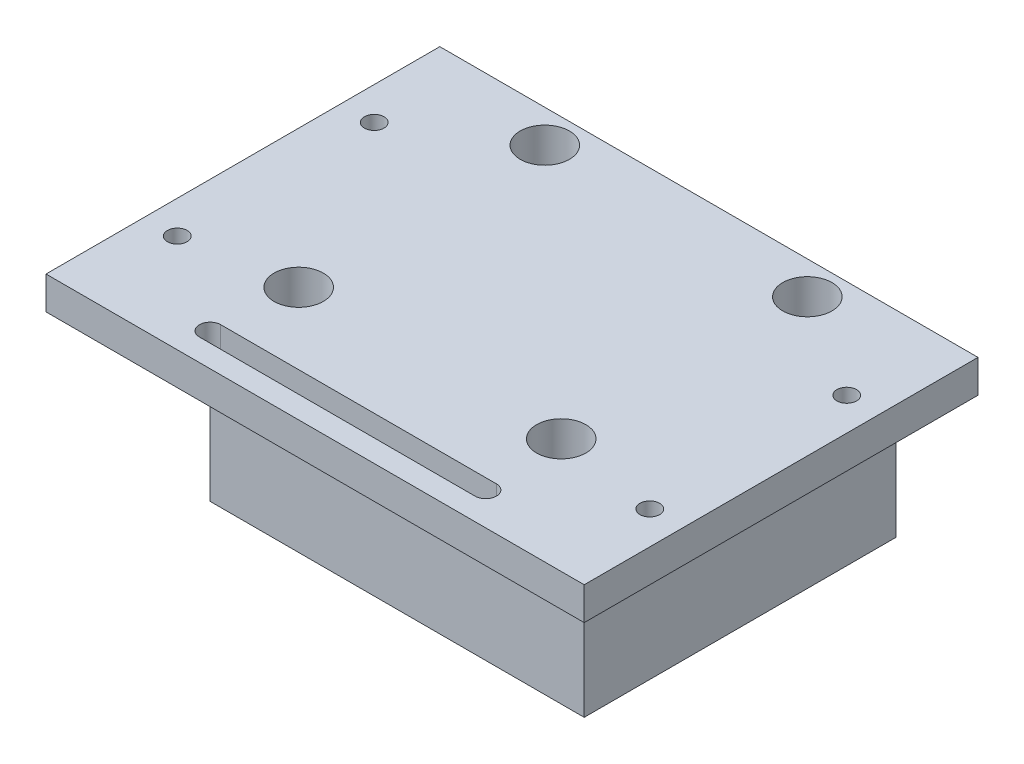
ISO-10303-21;
HEADER;
FILE_DESCRIPTION(('STEP AP214'),'2;1');
FILE_NAME('part.step','',(''),(''),'','','');
FILE_SCHEMA(('AUTOMOTIVE_DESIGN { 1 0 10303 214 1 1 1 1 }'));
ENDSEC;
DATA;
#1=APPLICATION_CONTEXT('core data for automotive mechanical design processes');
#2=APPLICATION_PROTOCOL_DEFINITION('international standard','automotive_design',2000,#1);
#3=PRODUCT_CONTEXT('',#1,'mechanical');
#4=PRODUCT('Part','Part','',(#3));
#5=PRODUCT_RELATED_PRODUCT_CATEGORY('part','',(#4));
#6=PRODUCT_DEFINITION_FORMATION('','',#4);
#7=PRODUCT_DEFINITION_CONTEXT('part definition',#1,'design');
#8=PRODUCT_DEFINITION('design','',#6,#7);
#9=PRODUCT_DEFINITION_SHAPE('','',#8);
#10=(LENGTH_UNIT() NAMED_UNIT(*) SI_UNIT(.MILLI.,.METRE.));
#11=(NAMED_UNIT(*) PLANE_ANGLE_UNIT() SI_UNIT($,.RADIAN.));
#12=(NAMED_UNIT(*) SI_UNIT($,.STERADIAN.) SOLID_ANGLE_UNIT());
#13=UNCERTAINTY_MEASURE_WITH_UNIT(LENGTH_MEASURE(1.E-05),#10,'distance_accuracy_value','');
#14=(GEOMETRIC_REPRESENTATION_CONTEXT(3) GLOBAL_UNCERTAINTY_ASSIGNED_CONTEXT((#13)) GLOBAL_UNIT_ASSIGNED_CONTEXT((#10,
#11,#12)) REPRESENTATION_CONTEXT('',''));
#15=CARTESIAN_POINT('',(0.,0.,0.));
#16=DIRECTION('',(0.,0.,1.));
#17=DIRECTION('',(1.,0.,0.));
#18=AXIS2_PLACEMENT_3D('',#15,#16,#17);
#19=CARTESIAN_POINT('',(57.,60.,-47.5));
#20=DIRECTION('',(-1.,0.,0.));
#21=DIRECTION('',(0.,0.,1.));
#22=AXIS2_PLACEMENT_3D('',#19,#20,#21);
#23=PLANE('',#22);
#24=DIRECTION('',(0.,0.,-1.));
#25=VECTOR('',#24,1.);
#26=CARTESIAN_POINT('',(57.,50.,0.));
#27=LINE('',#26,#25);
#28=CARTESIAN_POINT('',(57.,50.,47.5));
#29=VERTEX_POINT('',#28);
#30=CARTESIAN_POINT('',(57.,50.,-47.5));
#31=VERTEX_POINT('',#30);
#32=EDGE_CURVE('E222',#29,#31,#27,.T.);
#33=ORIENTED_EDGE('',*,*,#32,.F.);
#34=DIRECTION('',(0.,-1.,0.));
#35=VECTOR('',#34,1.);
#36=CARTESIAN_POINT('',(57.,60.,47.5));
#37=LINE('',#36,#35);
#38=CARTESIAN_POINT('',(57.,0.,47.5));
#39=VERTEX_POINT('',#38);
#40=EDGE_CURVE('E253',#29,#39,#37,.T.);
#41=ORIENTED_EDGE('',*,*,#40,.T.);
#42=DIRECTION('',(0.,0.,-1.));
#43=VECTOR('',#42,1.);
#44=CARTESIAN_POINT('',(57.,0.,-47.5));
#45=LINE('',#44,#43);
#46=CARTESIAN_POINT('',(57.,0.,-47.5));
#47=VERTEX_POINT('',#46);
#48=EDGE_CURVE('E243',#39,#47,#45,.T.);
#49=ORIENTED_EDGE('',*,*,#48,.T.);
#50=DIRECTION('',(0.,-1.,0.));
#51=VECTOR('',#50,1.);
#52=CARTESIAN_POINT('',(57.,60.,-47.5));
#53=LINE('',#52,#51);
#54=EDGE_CURVE('E11',#31,#47,#53,.T.);
#55=ORIENTED_EDGE('',*,*,#54,.F.);
#56=EDGE_LOOP('',(#33,#41,#49,#55));
#57=FACE_BOUND('',#56,.T.);
#58=ADVANCED_FACE('F38',(#57),#23,.F.);
#59=CARTESIAN_POINT('',(-57.,60.,-47.5));
#60=DIRECTION('',(1.,0.,0.));
#61=DIRECTION('',(0.,0.,-1.));
#62=AXIS2_PLACEMENT_3D('',#59,#60,#61);
#63=PLANE('',#62);
#64=DIRECTION('',(0.,0.,1.));
#65=VECTOR('',#64,1.);
#66=CARTESIAN_POINT('',(-57.,50.,0.));
#67=LINE('',#66,#65);
#68=CARTESIAN_POINT('',(-57.,50.,-47.5));
#69=VERTEX_POINT('',#68);
#70=CARTESIAN_POINT('',(-57.,50.,47.5));
#71=VERTEX_POINT('',#70);
#72=EDGE_CURVE('E226',#69,#71,#67,.T.);
#73=ORIENTED_EDGE('',*,*,#72,.F.);
#74=DIRECTION('',(0.,-1.,0.));
#75=VECTOR('',#74,1.);
#76=CARTESIAN_POINT('',(-57.,60.,-47.5));
#77=LINE('',#76,#75);
#78=CARTESIAN_POINT('',(-57.,0.,-47.5));
#79=VERTEX_POINT('',#78);
#80=EDGE_CURVE('E45',#69,#79,#77,.T.);
#81=ORIENTED_EDGE('',*,*,#80,.T.);
#82=DIRECTION('',(0.,0.,1.));
#83=VECTOR('',#82,1.);
#84=CARTESIAN_POINT('',(-57.,0.,-47.5));
#85=LINE('',#84,#83);
#86=CARTESIAN_POINT('',(-57.,0.,47.5));
#87=VERTEX_POINT('',#86);
#88=EDGE_CURVE('E260',#79,#87,#85,.T.);
#89=ORIENTED_EDGE('',*,*,#88,.T.);
#90=DIRECTION('',(0.,-1.,0.));
#91=VECTOR('',#90,1.);
#92=CARTESIAN_POINT('',(-57.,60.,47.5));
#93=LINE('',#92,#91);
#94=EDGE_CURVE('E266',#71,#87,#93,.T.);
#95=ORIENTED_EDGE('',*,*,#94,.F.);
#96=EDGE_LOOP('',(#73,#81,#89,#95));
#97=FACE_BOUND('',#96,.T.);
#98=ADVANCED_FACE('F270',(#97),#63,.F.);
#99=CARTESIAN_POINT('',(-57.,60.,47.5));
#100=DIRECTION('',(0.,0.,-1.));
#101=DIRECTION('',(-1.,0.,0.));
#102=AXIS2_PLACEMENT_3D('',#99,#100,#101);
#103=PLANE('',#102);
#104=DIRECTION('',(1.,0.,0.));
#105=VECTOR('',#104,1.);
#106=CARTESIAN_POINT('',(0.,50.,47.5));
#107=LINE('',#106,#105);
#108=EDGE_CURVE('E224',#71,#29,#107,.T.);
#109=ORIENTED_EDGE('',*,*,#108,.F.);
#110=ORIENTED_EDGE('',*,*,#94,.T.);
#111=DIRECTION('',(1.,0.,0.));
#112=VECTOR('',#111,1.);
#113=CARTESIAN_POINT('',(-57.,0.,47.5));
#114=LINE('',#113,#112);
#115=EDGE_CURVE('E254',#87,#39,#114,.T.);
#116=ORIENTED_EDGE('',*,*,#115,.T.);
#117=ORIENTED_EDGE('',*,*,#40,.F.);
#118=EDGE_LOOP('',(#109,#110,#116,#117));
#119=FACE_BOUND('',#118,.T.);
#120=ADVANCED_FACE('F285',(#119),#103,.F.);
#121=CARTESIAN_POINT('',(-57.,60.,-47.5));
#122=DIRECTION('',(0.,0.,1.));
#123=DIRECTION('',(1.,0.,0.));
#124=AXIS2_PLACEMENT_3D('',#121,#122,#123);
#125=PLANE('',#124);
#126=DIRECTION('',(-1.,0.,0.));
#127=VECTOR('',#126,1.);
#128=CARTESIAN_POINT('',(-57.,0.,-47.5));
#129=LINE('',#128,#127);
#130=EDGE_CURVE('E257',#47,#79,#129,.T.);
#131=ORIENTED_EDGE('',*,*,#130,.T.);
#132=ORIENTED_EDGE('',*,*,#80,.F.);
#133=DIRECTION('',(-1.,0.,0.));
#134=VECTOR('',#133,1.);
#135=CARTESIAN_POINT('',(0.,50.,-47.5));
#136=LINE('',#135,#134);
#137=CARTESIAN_POINT('',(-82.,50.,-47.5));
#138=VERTEX_POINT('',#137);
#139=EDGE_CURVE('E228',#69,#138,#136,.T.);
#140=ORIENTED_EDGE('',*,*,#139,.T.);
#141=DIRECTION('',(0.,1.,0.));
#142=VECTOR('',#141,1.);
#143=CARTESIAN_POINT('',(-82.,50.,-47.5));
#144=LINE('',#143,#142);
#145=CARTESIAN_POINT('',(-82.,60.,-47.5));
#146=VERTEX_POINT('',#145);
#147=EDGE_CURVE('E244',#138,#146,#144,.T.);
#148=ORIENTED_EDGE('',*,*,#147,.T.);
#149=DIRECTION('',(-1.,0.,0.));
#150=VECTOR('',#149,1.);
#151=CARTESIAN_POINT('',(-57.,60.,-47.5));
#152=LINE('',#151,#150);
#153=CARTESIAN_POINT('',(82.,60.,-47.5));
#154=VERTEX_POINT('',#153);
#155=EDGE_CURVE('E251',#154,#146,#152,.T.);
#156=ORIENTED_EDGE('',*,*,#155,.F.);
#157=DIRECTION('',(0.,1.,0.));
#158=VECTOR('',#157,1.);
#159=CARTESIAN_POINT('',(82.,50.,-47.5));
#160=LINE('',#159,#158);
#161=CARTESIAN_POINT('',(82.,50.,-47.5));
#162=VERTEX_POINT('',#161);
#163=EDGE_CURVE('E247',#162,#154,#160,.T.);
#164=ORIENTED_EDGE('',*,*,#163,.F.);
#165=DIRECTION('',(1.,0.,0.));
#166=VECTOR('',#165,1.);
#167=CARTESIAN_POINT('',(0.,50.,-47.5));
#168=LINE('',#167,#166);
#169=EDGE_CURVE('E220',#31,#162,#168,.T.);
#170=ORIENTED_EDGE('',*,*,#169,.F.);
#171=ORIENTED_EDGE('',*,*,#54,.T.);
#172=EDGE_LOOP('',(#131,#132,#140,#148,#156,#164,#170,#171));
#173=FACE_BOUND('',#172,.T.);
#174=ADVANCED_FACE('F276',(#173),#125,.F.);
#175=CARTESIAN_POINT('',(0.,60.,0.));
#176=DIRECTION('',(0.,1.,0.));
#177=DIRECTION('',(0.,0.,1.));
#178=AXIS2_PLACEMENT_3D('',#175,#176,#177);
#179=PLANE('',#178);
#180=CARTESIAN_POINT('',(72.,60.,-17.5));
#181=DIRECTION('',(0.,1.,0.));
#182=DIRECTION('',(0.,0.,1.));
#183=AXIS2_PLACEMENT_3D('',#180,#181,#182);
#184=CIRCLE('',#183,3.00000000000001);
#185=CARTESIAN_POINT('',(72.,60.,-14.5));
#186=VERTEX_POINT('',#185);
#187=EDGE_CURVE('E407',#186,#186,#184,.F.);
#188=ORIENTED_EDGE('',*,*,#187,.T.);
#189=EDGE_LOOP('',(#188));
#190=FACE_BOUND('',#189,.T.);
#191=CARTESIAN_POINT('',(72.,60.,42.5));
#192=DIRECTION('',(0.,1.,0.));
#193=DIRECTION('',(0.,0.,1.));
#194=AXIS2_PLACEMENT_3D('',#191,#192,#193);
#195=CIRCLE('',#194,3.00000000000001);
#196=CARTESIAN_POINT('',(72.,60.,45.5));
#197=VERTEX_POINT('',#196);
#198=EDGE_CURVE('E417',#197,#197,#195,.F.);
#199=ORIENTED_EDGE('',*,*,#198,.T.);
#200=EDGE_LOOP('',(#199));
#201=FACE_BOUND('',#200,.T.);
#202=CARTESIAN_POINT('',(-72.,60.,-17.5));
#203=DIRECTION('',(0.,1.,0.));
#204=DIRECTION('',(0.,0.,1.));
#205=AXIS2_PLACEMENT_3D('',#202,#203,#204);
#206=CIRCLE('',#205,3.00000000000001);
#207=CARTESIAN_POINT('',(-72.,60.,-14.5));
#208=VERTEX_POINT('',#207);
#209=EDGE_CURVE('E423',#208,#208,#206,.T.);
#210=ORIENTED_EDGE('',*,*,#209,.F.);
#211=EDGE_LOOP('',(#210));
#212=FACE_BOUND('',#211,.T.);
#213=CARTESIAN_POINT('',(-72.,60.,42.5));
#214=DIRECTION('',(0.,1.,0.));
#215=DIRECTION('',(0.,0.,1.));
#216=AXIS2_PLACEMENT_3D('',#213,#214,#215);
#217=CIRCLE('',#216,3.00000000000001);
#218=CARTESIAN_POINT('',(-72.,60.,45.5));
#219=VERTEX_POINT('',#218);
#220=EDGE_CURVE('E149',#219,#219,#217,.T.);
#221=ORIENTED_EDGE('',*,*,#220,.F.);
#222=EDGE_LOOP('',(#221));
#223=FACE_BOUND('',#222,.T.);
#224=DIRECTION('',(1.,0.,0.));
#225=VECTOR('',#224,1.);
#226=CARTESIAN_POINT('',(0.,60.,59.25));
#227=LINE('',#226,#225);
#228=CARTESIAN_POINT('',(-42.,60.,59.25));
#229=VERTEX_POINT('',#228);
#230=CARTESIAN_POINT('',(42.,60.,59.25));
#231=VERTEX_POINT('',#230);
#232=EDGE_CURVE('E127',#229,#231,#227,.T.);
#233=ORIENTED_EDGE('',*,*,#232,.T.);
#234=CARTESIAN_POINT('',(42.,60.,62.5));
#235=DIRECTION('',(0.,-1.,0.));
#236=DIRECTION('',(0.,0.,-1.));
#237=AXIS2_PLACEMENT_3D('',#234,#235,#236);
#238=CIRCLE('',#237,3.25);
#239=CARTESIAN_POINT('',(42.,60.,65.75));
#240=VERTEX_POINT('',#239);
#241=EDGE_CURVE('E136',#231,#240,#238,.T.);
#242=ORIENTED_EDGE('',*,*,#241,.T.);
#243=DIRECTION('',(-1.,0.,0.));
#244=VECTOR('',#243,1.);
#245=CARTESIAN_POINT('',(0.,60.,65.75));
#246=LINE('',#245,#244);
#247=CARTESIAN_POINT('',(-42.,60.,65.75));
#248=VERTEX_POINT('',#247);
#249=EDGE_CURVE('E52',#240,#248,#246,.T.);
#250=ORIENTED_EDGE('',*,*,#249,.T.);
#251=CARTESIAN_POINT('',(-42.,60.,62.5));
#252=DIRECTION('',(0.,-1.,0.));
#253=DIRECTION('',(0.,0.,-1.));
#254=AXIS2_PLACEMENT_3D('',#251,#252,#253);
#255=CIRCLE('',#254,3.25);
#256=EDGE_CURVE('E133',#248,#229,#255,.T.);
#257=ORIENTED_EDGE('',*,*,#256,.T.);
#258=EDGE_LOOP('',(#233,#242,#250,#257));
#259=FACE_BOUND('',#258,.T.);
#260=CARTESIAN_POINT('',(-40.,60.,-37.5));
#261=DIRECTION('',(0.,-1.,0.));
#262=DIRECTION('',(0.,0.,-1.));
#263=AXIS2_PLACEMENT_3D('',#260,#261,#262);
#264=CIRCLE('',#263,7.5);
#265=CARTESIAN_POINT('',(-40.,60.,-45.));
#266=VERTEX_POINT('',#265);
#267=EDGE_CURVE('E170',#266,#266,#264,.T.);
#268=ORIENTED_EDGE('',*,*,#267,.T.);
#269=EDGE_LOOP('',(#268));
#270=FACE_BOUND('',#269,.T.);
#271=CARTESIAN_POINT('',(40.,60.,-37.5));
#272=DIRECTION('',(0.,1.,0.));
#273=DIRECTION('',(0.,0.,-1.));
#274=AXIS2_PLACEMENT_3D('',#271,#272,#273);
#275=CIRCLE('',#274,7.5);
#276=CARTESIAN_POINT('',(40.,60.,-45.));
#277=VERTEX_POINT('',#276);
#278=EDGE_CURVE('E182',#277,#277,#275,.T.);
#279=ORIENTED_EDGE('',*,*,#278,.F.);
#280=EDGE_LOOP('',(#279));
#281=FACE_BOUND('',#280,.T.);
#282=CARTESIAN_POINT('',(40.,60.,37.5));
#283=DIRECTION('',(0.,-1.,0.));
#284=DIRECTION('',(0.,0.,1.));
#285=AXIS2_PLACEMENT_3D('',#282,#283,#284);
#286=CIRCLE('',#285,7.5);
#287=CARTESIAN_POINT('',(40.,60.,45.));
#288=VERTEX_POINT('',#287);
#289=EDGE_CURVE('E194',#288,#288,#286,.T.);
#290=ORIENTED_EDGE('',*,*,#289,.T.);
#291=EDGE_LOOP('',(#290));
#292=FACE_BOUND('',#291,.T.);
#293=CARTESIAN_POINT('',(-40.,60.,37.5));
#294=DIRECTION('',(0.,1.,0.));
#295=DIRECTION('',(0.,0.,1.));
#296=AXIS2_PLACEMENT_3D('',#293,#294,#295);
#297=CIRCLE('',#296,7.5);
#298=CARTESIAN_POINT('',(-40.,60.,45.));
#299=VERTEX_POINT('',#298);
#300=EDGE_CURVE('E206',#299,#299,#297,.T.);
#301=ORIENTED_EDGE('',*,*,#300,.F.);
#302=EDGE_LOOP('',(#301));
#303=FACE_BOUND('',#302,.T.);
#304=ORIENTED_EDGE('',*,*,#155,.T.);
#305=DIRECTION('',(0.,0.,-1.));
#306=VECTOR('',#305,1.);
#307=CARTESIAN_POINT('',(-82.,60.,0.));
#308=LINE('',#307,#306);
#309=CARTESIAN_POINT('',(-82.,60.,72.5));
#310=VERTEX_POINT('',#309);
#311=EDGE_CURVE('E217',#310,#146,#308,.T.);
#312=ORIENTED_EDGE('',*,*,#311,.F.);
#313=DIRECTION('',(1.,0.,0.));
#314=VECTOR('',#313,1.);
#315=CARTESIAN_POINT('',(0.,60.,72.5));
#316=LINE('',#315,#314);
#317=CARTESIAN_POINT('',(82.,60.,72.5));
#318=VERTEX_POINT('',#317);
#319=EDGE_CURVE('E210',#310,#318,#316,.T.);
#320=ORIENTED_EDGE('',*,*,#319,.T.);
#321=DIRECTION('',(0.,0.,-1.));
#322=VECTOR('',#321,1.);
#323=CARTESIAN_POINT('',(82.,60.,0.));
#324=LINE('',#323,#322);
#325=EDGE_CURVE('E236',#318,#154,#324,.T.);
#326=ORIENTED_EDGE('',*,*,#325,.T.);
#327=EDGE_LOOP('',(#304,#312,#320,#326));
#328=FACE_BOUND('',#327,.T.);
#329=ADVANCED_FACE('F140',(#190,#201,#212,#223,#259,#270,#281,#292,#303,#328),#179,.T.);
#330=CARTESIAN_POINT('',(0.,0.,0.));
#331=DIRECTION('',(0.,1.,0.));
#332=DIRECTION('',(0.,0.,1.));
#333=AXIS2_PLACEMENT_3D('',#330,#331,#332);
#334=PLANE('',#333);
#335=CARTESIAN_POINT('',(-40.,0.,-37.5));
#336=DIRECTION('',(0.,1.,0.));
#337=DIRECTION('',(0.,0.,1.));
#338=AXIS2_PLACEMENT_3D('',#335,#336,#337);
#339=CIRCLE('',#338,3.3);
#340=CARTESIAN_POINT('',(-40.,0.,-34.2));
#341=VERTEX_POINT('',#340);
#342=EDGE_CURVE('E167',#341,#341,#339,.F.);
#343=ORIENTED_EDGE('',*,*,#342,.F.);
#344=EDGE_LOOP('',(#343));
#345=FACE_BOUND('',#344,.T.);
#346=CARTESIAN_POINT('',(40.,0.,-37.5));
#347=DIRECTION('',(0.,1.,0.));
#348=DIRECTION('',(0.,0.,1.));
#349=AXIS2_PLACEMENT_3D('',#346,#347,#348);
#350=CIRCLE('',#349,3.3);
#351=CARTESIAN_POINT('',(40.,0.,-34.2));
#352=VERTEX_POINT('',#351);
#353=EDGE_CURVE('E179',#352,#352,#350,.T.);
#354=ORIENTED_EDGE('',*,*,#353,.T.);
#355=EDGE_LOOP('',(#354));
#356=FACE_BOUND('',#355,.T.);
#357=CARTESIAN_POINT('',(40.,0.,37.5));
#358=DIRECTION('',(0.,1.,0.));
#359=DIRECTION('',(0.,0.,1.));
#360=AXIS2_PLACEMENT_3D('',#357,#358,#359);
#361=CIRCLE('',#360,3.3);
#362=CARTESIAN_POINT('',(40.,0.,40.8));
#363=VERTEX_POINT('',#362);
#364=EDGE_CURVE('E191',#363,#363,#361,.F.);
#365=ORIENTED_EDGE('',*,*,#364,.F.);
#366=EDGE_LOOP('',(#365));
#367=FACE_BOUND('',#366,.T.);
#368=CARTESIAN_POINT('',(-40.,0.,37.5));
#369=DIRECTION('',(0.,1.,0.));
#370=DIRECTION('',(0.,0.,1.));
#371=AXIS2_PLACEMENT_3D('',#368,#369,#370);
#372=CIRCLE('',#371,3.3);
#373=CARTESIAN_POINT('',(-40.,0.,40.8));
#374=VERTEX_POINT('',#373);
#375=EDGE_CURVE('E203',#374,#374,#372,.T.);
#376=ORIENTED_EDGE('',*,*,#375,.T.);
#377=EDGE_LOOP('',(#376));
#378=FACE_BOUND('',#377,.T.);
#379=ORIENTED_EDGE('',*,*,#48,.F.);
#380=ORIENTED_EDGE('',*,*,#115,.F.);
#381=ORIENTED_EDGE('',*,*,#88,.F.);
#382=ORIENTED_EDGE('',*,*,#130,.F.);
#383=EDGE_LOOP('',(#379,#380,#381,#382));
#384=FACE_BOUND('',#383,.T.);
#385=ADVANCED_FACE('F281',(#345,#356,#367,#378,#384),#334,.F.);
#386=CARTESIAN_POINT('',(0.,50.,72.5));
#387=DIRECTION('',(0.,0.,1.));
#388=DIRECTION('',(1.,0.,0.));
#389=AXIS2_PLACEMENT_3D('',#386,#387,#388);
#390=PLANE('',#389);
#391=ORIENTED_EDGE('',*,*,#319,.F.);
#392=DIRECTION('',(0.,1.,0.));
#393=VECTOR('',#392,1.);
#394=CARTESIAN_POINT('',(-82.,50.,72.5));
#395=LINE('',#394,#393);
#396=CARTESIAN_POINT('',(-82.,50.,72.5));
#397=VERTEX_POINT('',#396);
#398=EDGE_CURVE('E241',#397,#310,#395,.T.);
#399=ORIENTED_EDGE('',*,*,#398,.F.);
#400=DIRECTION('',(1.,0.,0.));
#401=VECTOR('',#400,1.);
#402=CARTESIAN_POINT('',(0.,50.,72.5));
#403=LINE('',#402,#401);
#404=CARTESIAN_POINT('',(82.,50.,72.5));
#405=VERTEX_POINT('',#404);
#406=EDGE_CURVE('E213',#397,#405,#403,.T.);
#407=ORIENTED_EDGE('',*,*,#406,.T.);
#408=DIRECTION('',(0.,1.,0.));
#409=VECTOR('',#408,1.);
#410=CARTESIAN_POINT('',(82.,50.,72.5));
#411=LINE('',#410,#409);
#412=EDGE_CURVE('E233',#405,#318,#411,.T.);
#413=ORIENTED_EDGE('',*,*,#412,.T.);
#414=EDGE_LOOP('',(#391,#399,#407,#413));
#415=FACE_BOUND('',#414,.T.);
#416=ADVANCED_FACE('F310',(#415),#390,.T.);
#417=CARTESIAN_POINT('',(-82.,50.,0.));
#418=DIRECTION('',(1.,0.,0.));
#419=DIRECTION('',(0.,0.,-1.));
#420=AXIS2_PLACEMENT_3D('',#417,#418,#419);
#421=PLANE('',#420);
#422=ORIENTED_EDGE('',*,*,#311,.T.);
#423=ORIENTED_EDGE('',*,*,#147,.F.);
#424=DIRECTION('',(0.,0.,-1.));
#425=VECTOR('',#424,1.);
#426=CARTESIAN_POINT('',(-82.,50.,0.));
#427=LINE('',#426,#425);
#428=EDGE_CURVE('E231',#397,#138,#427,.T.);
#429=ORIENTED_EDGE('',*,*,#428,.F.);
#430=ORIENTED_EDGE('',*,*,#398,.T.);
#431=EDGE_LOOP('',(#422,#423,#429,#430));
#432=FACE_BOUND('',#431,.T.);
#433=ADVANCED_FACE('F317',(#432),#421,.F.);
#434=CARTESIAN_POINT('',(82.,50.,0.));
#435=DIRECTION('',(1.,0.,0.));
#436=DIRECTION('',(0.,0.,-1.));
#437=AXIS2_PLACEMENT_3D('',#434,#435,#436);
#438=PLANE('',#437);
#439=ORIENTED_EDGE('',*,*,#325,.F.);
#440=ORIENTED_EDGE('',*,*,#412,.F.);
#441=DIRECTION('',(0.,0.,-1.));
#442=VECTOR('',#441,1.);
#443=CARTESIAN_POINT('',(82.,50.,0.));
#444=LINE('',#443,#442);
#445=EDGE_CURVE('E216',#405,#162,#444,.T.);
#446=ORIENTED_EDGE('',*,*,#445,.T.);
#447=ORIENTED_EDGE('',*,*,#163,.T.);
#448=EDGE_LOOP('',(#439,#440,#446,#447));
#449=FACE_BOUND('',#448,.T.);
#450=ADVANCED_FACE('F319',(#449),#438,.T.);
#451=CARTESIAN_POINT('',(0.,50.,0.));
#452=DIRECTION('',(0.,1.,0.));
#453=DIRECTION('',(0.,0.,1.));
#454=AXIS2_PLACEMENT_3D('',#451,#452,#453);
#455=PLANE('',#454);
#456=CARTESIAN_POINT('',(72.,50.,-17.5));
#457=DIRECTION('',(0.,1.,0.));
#458=DIRECTION('',(0.,0.,-1.));
#459=AXIS2_PLACEMENT_3D('',#456,#457,#458);
#460=CIRCLE('',#459,3.00000000000001);
#461=CARTESIAN_POINT('',(72.,50.,-20.5));
#462=VERTEX_POINT('',#461);
#463=EDGE_CURVE('E410',#462,#462,#460,.T.);
#464=ORIENTED_EDGE('',*,*,#463,.T.);
#465=EDGE_LOOP('',(#464));
#466=FACE_BOUND('',#465,.T.);
#467=CARTESIAN_POINT('',(72.,50.,42.5));
#468=DIRECTION('',(0.,1.,0.));
#469=DIRECTION('',(0.,0.,-1.));
#470=AXIS2_PLACEMENT_3D('',#467,#468,#469);
#471=CIRCLE('',#470,3.00000000000001);
#472=CARTESIAN_POINT('',(72.,50.,39.5));
#473=VERTEX_POINT('',#472);
#474=EDGE_CURVE('E412',#473,#473,#471,.T.);
#475=ORIENTED_EDGE('',*,*,#474,.T.);
#476=EDGE_LOOP('',(#475));
#477=FACE_BOUND('',#476,.T.);
#478=CARTESIAN_POINT('',(-72.,50.,-17.5));
#479=DIRECTION('',(0.,-1.,0.));
#480=DIRECTION('',(0.,0.,-1.));
#481=AXIS2_PLACEMENT_3D('',#478,#479,#480);
#482=CIRCLE('',#481,3.00000000000001);
#483=CARTESIAN_POINT('',(-72.,50.,-20.5));
#484=VERTEX_POINT('',#483);
#485=EDGE_CURVE('E420',#484,#484,#482,.T.);
#486=ORIENTED_EDGE('',*,*,#485,.F.);
#487=EDGE_LOOP('',(#486));
#488=FACE_BOUND('',#487,.T.);
#489=CARTESIAN_POINT('',(-72.,50.,42.5));
#490=DIRECTION('',(0.,-1.,0.));
#491=DIRECTION('',(0.,0.,-1.));
#492=AXIS2_PLACEMENT_3D('',#489,#490,#491);
#493=CIRCLE('',#492,3.00000000000001);
#494=CARTESIAN_POINT('',(-72.,50.,39.5));
#495=VERTEX_POINT('',#494);
#496=EDGE_CURVE('E425',#495,#495,#493,.T.);
#497=ORIENTED_EDGE('',*,*,#496,.F.);
#498=EDGE_LOOP('',(#497));
#499=FACE_BOUND('',#498,.T.);
#500=CARTESIAN_POINT('',(42.,50.,62.5));
#501=DIRECTION('',(0.,-1.,0.));
#502=DIRECTION('',(0.,0.,-1.));
#503=AXIS2_PLACEMENT_3D('',#500,#501,#502);
#504=CIRCLE('',#503,3.25);
#505=CARTESIAN_POINT('',(42.,50.,59.25));
#506=VERTEX_POINT('',#505);
#507=CARTESIAN_POINT('',(42.,50.,65.75));
#508=VERTEX_POINT('',#507);
#509=EDGE_CURVE('E155',#506,#508,#504,.T.);
#510=ORIENTED_EDGE('',*,*,#509,.F.);
#511=DIRECTION('',(1.,0.,0.));
#512=VECTOR('',#511,1.);
#513=CARTESIAN_POINT('',(0.,50.,59.25));
#514=LINE('',#513,#512);
#515=CARTESIAN_POINT('',(-42.,50.,59.25));
#516=VERTEX_POINT('',#515);
#517=EDGE_CURVE('E60',#516,#506,#514,.T.);
#518=ORIENTED_EDGE('',*,*,#517,.F.);
#519=CARTESIAN_POINT('',(-42.,50.,62.5));
#520=DIRECTION('',(0.,-1.,0.));
#521=DIRECTION('',(0.,0.,-1.));
#522=AXIS2_PLACEMENT_3D('',#519,#520,#521);
#523=CIRCLE('',#522,3.25);
#524=CARTESIAN_POINT('',(-42.,50.,65.75));
#525=VERTEX_POINT('',#524);
#526=EDGE_CURVE('E143',#525,#516,#523,.T.);
#527=ORIENTED_EDGE('',*,*,#526,.F.);
#528=DIRECTION('',(-1.,0.,0.));
#529=VECTOR('',#528,1.);
#530=CARTESIAN_POINT('',(0.,50.,65.75));
#531=LINE('',#530,#529);
#532=EDGE_CURVE('E146',#508,#525,#531,.T.);
#533=ORIENTED_EDGE('',*,*,#532,.F.);
#534=EDGE_LOOP('',(#510,#518,#527,#533));
#535=FACE_BOUND('',#534,.T.);
#536=ORIENTED_EDGE('',*,*,#406,.F.);
#537=ORIENTED_EDGE('',*,*,#428,.T.);
#538=ORIENTED_EDGE('',*,*,#139,.F.);
#539=ORIENTED_EDGE('',*,*,#72,.T.);
#540=ORIENTED_EDGE('',*,*,#108,.T.);
#541=ORIENTED_EDGE('',*,*,#32,.T.);
#542=ORIENTED_EDGE('',*,*,#169,.T.);
#543=ORIENTED_EDGE('',*,*,#445,.F.);
#544=EDGE_LOOP('',(#536,#537,#538,#539,#540,#541,#542,#543));
#545=FACE_BOUND('',#544,.T.);
#546=ADVANCED_FACE('F289',(#466,#477,#488,#499,#535,#545),#455,.F.);
#547=CARTESIAN_POINT('',(-40.,9.99999999999999,37.5));
#548=DIRECTION('',(0.,1.,0.));
#549=DIRECTION('',(0.,0.,1.));
#550=AXIS2_PLACEMENT_3D('',#547,#548,#549);
#551=CYLINDRICAL_SURFACE('',#550,7.5);
#552=CARTESIAN_POINT('',(-40.,9.99999999999999,37.5));
#553=DIRECTION('',(0.,1.,0.));
#554=DIRECTION('',(0.,0.,1.));
#555=AXIS2_PLACEMENT_3D('',#552,#553,#554);
#556=CIRCLE('',#555,7.5);
#557=CARTESIAN_POINT('',(-40.,9.99999999999999,45.));
#558=VERTEX_POINT('',#557);
#559=EDGE_CURVE('E207',#558,#558,#556,.T.);
#560=ORIENTED_EDGE('',*,*,#559,.F.);
#561=EDGE_LOOP('',(#560));
#562=FACE_BOUND('',#561,.T.);
#563=ORIENTED_EDGE('',*,*,#300,.T.);
#564=EDGE_LOOP('',(#563));
#565=FACE_BOUND('',#564,.T.);
#566=ADVANCED_FACE('F328',(#562,#565),#551,.F.);
#567=CARTESIAN_POINT('',(-40.,9.99999999999999,37.5));
#568=DIRECTION('',(0.,1.,0.));
#569=DIRECTION('',(0.,0.,1.));
#570=AXIS2_PLACEMENT_3D('',#567,#568,#569);
#571=PLANE('',#570);
#572=CARTESIAN_POINT('',(-40.,9.99999999999999,37.5));
#573=DIRECTION('',(0.,1.,0.));
#574=DIRECTION('',(0.,0.,1.));
#575=AXIS2_PLACEMENT_3D('',#572,#573,#574);
#576=CIRCLE('',#575,3.3);
#577=CARTESIAN_POINT('',(-40.,9.99999999999999,40.8));
#578=VERTEX_POINT('',#577);
#579=EDGE_CURVE('E198',#578,#578,#576,.T.);
#580=ORIENTED_EDGE('',*,*,#579,.F.);
#581=EDGE_LOOP('',(#580));
#582=FACE_BOUND('',#581,.T.);
#583=ORIENTED_EDGE('',*,*,#559,.T.);
#584=EDGE_LOOP('',(#583));
#585=FACE_BOUND('',#584,.T.);
#586=ADVANCED_FACE('F332',(#582,#585),#571,.T.);
#587=CARTESIAN_POINT('',(-40.,-40.,37.5));
#588=DIRECTION('',(0.,1.,0.));
#589=DIRECTION('',(0.,0.,1.));
#590=AXIS2_PLACEMENT_3D('',#587,#588,#589);
#591=CYLINDRICAL_SURFACE('',#590,3.3);
#592=ORIENTED_EDGE('',*,*,#579,.T.);
#593=EDGE_LOOP('',(#592));
#594=FACE_BOUND('',#593,.T.);
#595=ORIENTED_EDGE('',*,*,#375,.F.);
#596=EDGE_LOOP('',(#595));
#597=FACE_BOUND('',#596,.T.);
#598=ADVANCED_FACE('F336',(#594,#597),#591,.F.);
#599=CARTESIAN_POINT('',(40.,9.99999999999999,37.5));
#600=DIRECTION('',(0.,1.,0.));
#601=DIRECTION('',(0.,0.,1.));
#602=AXIS2_PLACEMENT_3D('',#599,#600,#601);
#603=CYLINDRICAL_SURFACE('',#602,7.5);
#604=CARTESIAN_POINT('',(40.,9.99999999999999,37.5));
#605=DIRECTION('',(0.,-1.,0.));
#606=DIRECTION('',(0.,0.,1.));
#607=AXIS2_PLACEMENT_3D('',#604,#605,#606);
#608=CIRCLE('',#607,7.5);
#609=CARTESIAN_POINT('',(40.,9.99999999999999,45.));
#610=VERTEX_POINT('',#609);
#611=EDGE_CURVE('E195',#610,#610,#608,.T.);
#612=ORIENTED_EDGE('',*,*,#611,.T.);
#613=EDGE_LOOP('',(#612));
#614=FACE_BOUND('',#613,.T.);
#615=ORIENTED_EDGE('',*,*,#289,.F.);
#616=EDGE_LOOP('',(#615));
#617=FACE_BOUND('',#616,.T.);
#618=ADVANCED_FACE('F340',(#614,#617),#603,.F.);
#619=CARTESIAN_POINT('',(40.,9.99999999999999,37.5));
#620=DIRECTION('',(0.,1.,0.));
#621=DIRECTION('',(0.,0.,1.));
#622=AXIS2_PLACEMENT_3D('',#619,#620,#621);
#623=PLANE('',#622);
#624=CARTESIAN_POINT('',(40.,9.99999999999999,37.5));
#625=DIRECTION('',(0.,-1.,0.));
#626=DIRECTION('',(0.,0.,1.));
#627=AXIS2_PLACEMENT_3D('',#624,#625,#626);
#628=CIRCLE('',#627,3.3);
#629=CARTESIAN_POINT('',(40.,9.99999999999999,40.8));
#630=VERTEX_POINT('',#629);
#631=EDGE_CURVE('E186',#630,#630,#628,.T.);
#632=ORIENTED_EDGE('',*,*,#631,.T.);
#633=EDGE_LOOP('',(#632));
#634=FACE_BOUND('',#633,.T.);
#635=ORIENTED_EDGE('',*,*,#611,.F.);
#636=EDGE_LOOP('',(#635));
#637=FACE_BOUND('',#636,.T.);
#638=ADVANCED_FACE('F344',(#634,#637),#623,.T.);
#639=CARTESIAN_POINT('',(40.,-40.,37.5));
#640=DIRECTION('',(0.,1.,0.));
#641=DIRECTION('',(0.,0.,1.));
#642=AXIS2_PLACEMENT_3D('',#639,#640,#641);
#643=CYLINDRICAL_SURFACE('',#642,3.3);
#644=ORIENTED_EDGE('',*,*,#631,.F.);
#645=EDGE_LOOP('',(#644));
#646=FACE_BOUND('',#645,.T.);
#647=ORIENTED_EDGE('',*,*,#364,.T.);
#648=EDGE_LOOP('',(#647));
#649=FACE_BOUND('',#648,.T.);
#650=ADVANCED_FACE('F348',(#646,#649),#643,.F.);
#651=CARTESIAN_POINT('',(40.,9.99999999999999,-37.5));
#652=DIRECTION('',(0.,1.,0.));
#653=DIRECTION('',(0.,0.,1.));
#654=AXIS2_PLACEMENT_3D('',#651,#652,#653);
#655=CYLINDRICAL_SURFACE('',#654,7.5);
#656=CARTESIAN_POINT('',(40.,9.99999999999999,-37.5));
#657=DIRECTION('',(0.,1.,0.));
#658=DIRECTION('',(0.,0.,-1.));
#659=AXIS2_PLACEMENT_3D('',#656,#657,#658);
#660=CIRCLE('',#659,7.5);
#661=CARTESIAN_POINT('',(40.,9.99999999999999,-45.));
#662=VERTEX_POINT('',#661);
#663=EDGE_CURVE('E183',#662,#662,#660,.T.);
#664=ORIENTED_EDGE('',*,*,#663,.F.);
#665=EDGE_LOOP('',(#664));
#666=FACE_BOUND('',#665,.T.);
#667=ORIENTED_EDGE('',*,*,#278,.T.);
#668=EDGE_LOOP('',(#667));
#669=FACE_BOUND('',#668,.T.);
#670=ADVANCED_FACE('F352',(#666,#669),#655,.F.);
#671=CARTESIAN_POINT('',(40.,9.99999999999999,-37.5));
#672=DIRECTION('',(0.,1.,0.));
#673=DIRECTION('',(0.,0.,-1.));
#674=AXIS2_PLACEMENT_3D('',#671,#672,#673);
#675=PLANE('',#674);
#676=CARTESIAN_POINT('',(40.,9.99999999999999,-37.5));
#677=DIRECTION('',(0.,1.,0.));
#678=DIRECTION('',(0.,0.,-1.));
#679=AXIS2_PLACEMENT_3D('',#676,#677,#678);
#680=CIRCLE('',#679,3.3);
#681=CARTESIAN_POINT('',(40.,9.99999999999999,-40.8));
#682=VERTEX_POINT('',#681);
#683=EDGE_CURVE('E174',#682,#682,#680,.T.);
#684=ORIENTED_EDGE('',*,*,#683,.F.);
#685=EDGE_LOOP('',(#684));
#686=FACE_BOUND('',#685,.T.);
#687=ORIENTED_EDGE('',*,*,#663,.T.);
#688=EDGE_LOOP('',(#687));
#689=FACE_BOUND('',#688,.T.);
#690=ADVANCED_FACE('F356',(#686,#689),#675,.T.);
#691=CARTESIAN_POINT('',(40.,-40.,-37.5));
#692=DIRECTION('',(0.,1.,0.));
#693=DIRECTION('',(0.,0.,1.));
#694=AXIS2_PLACEMENT_3D('',#691,#692,#693);
#695=CYLINDRICAL_SURFACE('',#694,3.3);
#696=ORIENTED_EDGE('',*,*,#683,.T.);
#697=EDGE_LOOP('',(#696));
#698=FACE_BOUND('',#697,.T.);
#699=ORIENTED_EDGE('',*,*,#353,.F.);
#700=EDGE_LOOP('',(#699));
#701=FACE_BOUND('',#700,.T.);
#702=ADVANCED_FACE('F360',(#698,#701),#695,.F.);
#703=CARTESIAN_POINT('',(-40.,9.99999999999999,-37.5));
#704=DIRECTION('',(0.,1.,0.));
#705=DIRECTION('',(0.,0.,1.));
#706=AXIS2_PLACEMENT_3D('',#703,#704,#705);
#707=CYLINDRICAL_SURFACE('',#706,7.5);
#708=CARTESIAN_POINT('',(-40.,9.99999999999999,-37.5));
#709=DIRECTION('',(0.,-1.,0.));
#710=DIRECTION('',(0.,0.,-1.));
#711=AXIS2_PLACEMENT_3D('',#708,#709,#710);
#712=CIRCLE('',#711,7.5);
#713=CARTESIAN_POINT('',(-40.,9.99999999999999,-45.));
#714=VERTEX_POINT('',#713);
#715=EDGE_CURVE('E171',#714,#714,#712,.T.);
#716=ORIENTED_EDGE('',*,*,#715,.T.);
#717=EDGE_LOOP('',(#716));
#718=FACE_BOUND('',#717,.T.);
#719=ORIENTED_EDGE('',*,*,#267,.F.);
#720=EDGE_LOOP('',(#719));
#721=FACE_BOUND('',#720,.T.);
#722=ADVANCED_FACE('F364',(#718,#721),#707,.F.);
#723=CARTESIAN_POINT('',(-40.,9.99999999999999,-37.5));
#724=DIRECTION('',(0.,1.,0.));
#725=DIRECTION('',(0.,0.,-1.));
#726=AXIS2_PLACEMENT_3D('',#723,#724,#725);
#727=PLANE('',#726);
#728=CARTESIAN_POINT('',(-40.,9.99999999999999,-37.5));
#729=DIRECTION('',(0.,-1.,0.));
#730=DIRECTION('',(0.,0.,-1.));
#731=AXIS2_PLACEMENT_3D('',#728,#729,#730);
#732=CIRCLE('',#731,3.3);
#733=CARTESIAN_POINT('',(-40.,9.99999999999999,-40.8));
#734=VERTEX_POINT('',#733);
#735=EDGE_CURVE('E161',#734,#734,#732,.T.);
#736=ORIENTED_EDGE('',*,*,#735,.T.);
#737=EDGE_LOOP('',(#736));
#738=FACE_BOUND('',#737,.T.);
#739=ORIENTED_EDGE('',*,*,#715,.F.);
#740=EDGE_LOOP('',(#739));
#741=FACE_BOUND('',#740,.T.);
#742=ADVANCED_FACE('F368',(#738,#741),#727,.T.);
#743=CARTESIAN_POINT('',(-40.,-40.,-37.5));
#744=DIRECTION('',(0.,1.,0.));
#745=DIRECTION('',(0.,0.,1.));
#746=AXIS2_PLACEMENT_3D('',#743,#744,#745);
#747=CYLINDRICAL_SURFACE('',#746,3.3);
#748=ORIENTED_EDGE('',*,*,#735,.F.);
#749=EDGE_LOOP('',(#748));
#750=FACE_BOUND('',#749,.T.);
#751=ORIENTED_EDGE('',*,*,#342,.T.);
#752=EDGE_LOOP('',(#751));
#753=FACE_BOUND('',#752,.T.);
#754=ADVANCED_FACE('F372',(#750,#753),#747,.F.);
#755=CARTESIAN_POINT('',(0.,60.,59.25));
#756=DIRECTION('',(0.,0.,-1.));
#757=DIRECTION('',(-1.,0.,0.));
#758=AXIS2_PLACEMENT_3D('',#755,#756,#757);
#759=PLANE('',#758);
#760=ORIENTED_EDGE('',*,*,#517,.T.);
#761=DIRECTION('',(0.,-1.,0.));
#762=VECTOR('',#761,1.);
#763=CARTESIAN_POINT('',(42.,60.,59.25));
#764=LINE('',#763,#762);
#765=EDGE_CURVE('E123',#231,#506,#764,.T.);
#766=ORIENTED_EDGE('',*,*,#765,.F.);
#767=ORIENTED_EDGE('',*,*,#232,.F.);
#768=DIRECTION('',(0.,-1.,0.));
#769=VECTOR('',#768,1.);
#770=CARTESIAN_POINT('',(-42.,60.,59.25));
#771=LINE('',#770,#769);
#772=EDGE_CURVE('E159',#229,#516,#771,.T.);
#773=ORIENTED_EDGE('',*,*,#772,.T.);
#774=EDGE_LOOP('',(#760,#766,#767,#773));
#775=FACE_BOUND('',#774,.T.);
#776=ADVANCED_FACE('F125',(#775),#759,.F.);
#777=CARTESIAN_POINT('',(-42.,60.,62.5));
#778=DIRECTION('',(0.,-1.,0.));
#779=DIRECTION('',(0.,0.,-1.));
#780=AXIS2_PLACEMENT_3D('',#777,#778,#779);
#781=CYLINDRICAL_SURFACE('',#780,3.25);
#782=ORIENTED_EDGE('',*,*,#526,.T.);
#783=ORIENTED_EDGE('',*,*,#772,.F.);
#784=ORIENTED_EDGE('',*,*,#256,.F.);
#785=DIRECTION('',(0.,-1.,0.));
#786=VECTOR('',#785,1.);
#787=CARTESIAN_POINT('',(-42.,60.,65.75));
#788=LINE('',#787,#786);
#789=EDGE_CURVE('E162',#248,#525,#788,.T.);
#790=ORIENTED_EDGE('',*,*,#789,.T.);
#791=EDGE_LOOP('',(#782,#783,#784,#790));
#792=FACE_BOUND('',#791,.T.);
#793=ADVANCED_FACE('F379',(#792),#781,.F.);
#794=CARTESIAN_POINT('',(0.,60.,65.75));
#795=DIRECTION('',(0.,0.,1.));
#796=DIRECTION('',(1.,0.,0.));
#797=AXIS2_PLACEMENT_3D('',#794,#795,#796);
#798=PLANE('',#797);
#799=ORIENTED_EDGE('',*,*,#532,.T.);
#800=ORIENTED_EDGE('',*,*,#789,.F.);
#801=ORIENTED_EDGE('',*,*,#249,.F.);
#802=DIRECTION('',(0.,-1.,0.));
#803=VECTOR('',#802,1.);
#804=CARTESIAN_POINT('',(42.,60.,65.75));
#805=LINE('',#804,#803);
#806=EDGE_CURVE('E132',#240,#508,#805,.T.);
#807=ORIENTED_EDGE('',*,*,#806,.T.);
#808=EDGE_LOOP('',(#799,#800,#801,#807));
#809=FACE_BOUND('',#808,.T.);
#810=ADVANCED_FACE('F383',(#809),#798,.F.);
#811=CARTESIAN_POINT('',(42.,60.,62.5));
#812=DIRECTION('',(0.,-1.,0.));
#813=DIRECTION('',(0.,0.,-1.));
#814=AXIS2_PLACEMENT_3D('',#811,#812,#813);
#815=CYLINDRICAL_SURFACE('',#814,3.25);
#816=ORIENTED_EDGE('',*,*,#509,.T.);
#817=ORIENTED_EDGE('',*,*,#806,.F.);
#818=ORIENTED_EDGE('',*,*,#241,.F.);
#819=ORIENTED_EDGE('',*,*,#765,.T.);
#820=EDGE_LOOP('',(#816,#817,#818,#819));
#821=FACE_BOUND('',#820,.T.);
#822=ADVANCED_FACE('F137',(#821),#815,.F.);
#823=CARTESIAN_POINT('',(-72.,100.,42.5));
#824=DIRECTION('',(0.,-1.,0.));
#825=DIRECTION('',(0.,0.,-1.));
#826=AXIS2_PLACEMENT_3D('',#823,#824,#825);
#827=CYLINDRICAL_SURFACE('',#826,3.00000000000001);
#828=ORIENTED_EDGE('',*,*,#220,.T.);
#829=EDGE_LOOP('',(#828));
#830=FACE_BOUND('',#829,.T.);
#831=ORIENTED_EDGE('',*,*,#496,.T.);
#832=EDGE_LOOP('',(#831));
#833=FACE_BOUND('',#832,.T.);
#834=ADVANCED_FACE('F382',(#830,#833),#827,.F.);
#835=CARTESIAN_POINT('',(-72.,100.,-17.5));
#836=DIRECTION('',(0.,-1.,0.));
#837=DIRECTION('',(0.,0.,-1.));
#838=AXIS2_PLACEMENT_3D('',#835,#836,#837);
#839=CYLINDRICAL_SURFACE('',#838,3.00000000000001);
#840=ORIENTED_EDGE('',*,*,#209,.T.);
#841=EDGE_LOOP('',(#840));
#842=FACE_BOUND('',#841,.T.);
#843=ORIENTED_EDGE('',*,*,#485,.T.);
#844=EDGE_LOOP('',(#843));
#845=FACE_BOUND('',#844,.T.);
#846=ADVANCED_FACE('F391',(#842,#845),#839,.F.);
#847=CARTESIAN_POINT('',(72.,100.,42.5));
#848=DIRECTION('',(0.,-1.,0.));
#849=DIRECTION('',(0.,0.,-1.));
#850=AXIS2_PLACEMENT_3D('',#847,#848,#849);
#851=CYLINDRICAL_SURFACE('',#850,3.00000000000001);
#852=ORIENTED_EDGE('',*,*,#198,.F.);
#853=EDGE_LOOP('',(#852));
#854=FACE_BOUND('',#853,.T.);
#855=ORIENTED_EDGE('',*,*,#474,.F.);
#856=EDGE_LOOP('',(#855));
#857=FACE_BOUND('',#856,.T.);
#858=ADVANCED_FACE('F395',(#854,#857),#851,.F.);
#859=CARTESIAN_POINT('',(72.,100.,-17.5));
#860=DIRECTION('',(0.,-1.,0.));
#861=DIRECTION('',(0.,0.,-1.));
#862=AXIS2_PLACEMENT_3D('',#859,#860,#861);
#863=CYLINDRICAL_SURFACE('',#862,3.00000000000001);
#864=ORIENTED_EDGE('',*,*,#187,.F.);
#865=EDGE_LOOP('',(#864));
#866=FACE_BOUND('',#865,.T.);
#867=ORIENTED_EDGE('',*,*,#463,.F.);
#868=EDGE_LOOP('',(#867));
#869=FACE_BOUND('',#868,.T.);
#870=ADVANCED_FACE('F399',(#866,#869),#863,.F.);
#871=CLOSED_SHELL('',(#58,#98,#120,#174,#329,#385,#416,#433,#450,#546,#566,#586,#598,#618,#638,
#650,#670,#690,#702,#722,#742,#754,#776,#793,#810,#822,#834,#846,#858,#870));
#872=MANIFOLD_SOLID_BREP('B2',#871);
#873=ADVANCED_BREP_SHAPE_REPRESENTATION('',(#18,#872),#14);
#874=SHAPE_DEFINITION_REPRESENTATION(#9,#873);
ENDSEC;
END-ISO-10303-21;
